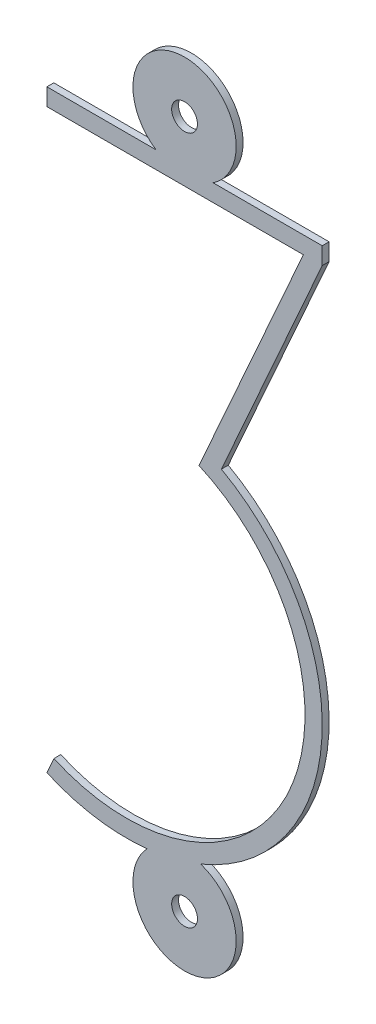
ISO-10303-21;
HEADER;
FILE_DESCRIPTION(('STEP AP214'),'2;1');
FILE_NAME('part.step','',(''),(''),'','','');
FILE_SCHEMA(('AUTOMOTIVE_DESIGN { 1 0 10303 214 1 1 1 1 }'));
ENDSEC;
DATA;
#1=APPLICATION_CONTEXT('core data for automotive mechanical design processes');
#2=APPLICATION_PROTOCOL_DEFINITION('international standard','automotive_design',2000,#1);
#3=PRODUCT_CONTEXT('',#1,'mechanical');
#4=PRODUCT('Part','Part','',(#3));
#5=PRODUCT_RELATED_PRODUCT_CATEGORY('part','',(#4));
#6=PRODUCT_DEFINITION_FORMATION('','',#4);
#7=PRODUCT_DEFINITION_CONTEXT('part definition',#1,'design');
#8=PRODUCT_DEFINITION('design','',#6,#7);
#9=PRODUCT_DEFINITION_SHAPE('','',#8);
#10=(LENGTH_UNIT() NAMED_UNIT(*) SI_UNIT(.MILLI.,.METRE.));
#11=(NAMED_UNIT(*) PLANE_ANGLE_UNIT() SI_UNIT($,.RADIAN.));
#12=(NAMED_UNIT(*) SI_UNIT($,.STERADIAN.) SOLID_ANGLE_UNIT());
#13=UNCERTAINTY_MEASURE_WITH_UNIT(LENGTH_MEASURE(1.E-05),#10,'distance_accuracy_value','');
#14=(GEOMETRIC_REPRESENTATION_CONTEXT(3) GLOBAL_UNCERTAINTY_ASSIGNED_CONTEXT((#13)) GLOBAL_UNIT_ASSIGNED_CONTEXT((#10,
#11,#12)) REPRESENTATION_CONTEXT('',''));
#15=CARTESIAN_POINT('',(0.,0.,0.));
#16=DIRECTION('',(0.,0.,1.));
#17=DIRECTION('',(1.,0.,0.));
#18=AXIS2_PLACEMENT_3D('',#15,#16,#17);
#19=CARTESIAN_POINT('',(-1.68855809367005,-3.31144190632995,0.1));
#20=DIRECTION('',(0.,0.,1.));
#21=DIRECTION('',(1.,0.,0.));
#22=AXIS2_PLACEMENT_3D('',#19,#20,#21);
#23=PLANE('',#22);
#24=CARTESIAN_POINT('',(0.,10.,0.1));
#25=DIRECTION('',(0.,0.,1.));
#26=DIRECTION('',(1.,0.,0.));
#27=AXIS2_PLACEMENT_3D('',#24,#25,#26);
#28=CIRCLE('',#27,0.375);
#29=CARTESIAN_POINT('',(0.375000000000002,10.,0.1));
#30=VERTEX_POINT('',#29);
#31=EDGE_CURVE('E166',#30,#30,#28,.T.);
#32=ORIENTED_EDGE('',*,*,#31,.F.);
#33=EDGE_LOOP('',(#32));
#34=FACE_BOUND('',#33,.T.);
#35=DIRECTION('',(0.,-1.,0.));
#36=VECTOR('',#35,1.);
#37=CARTESIAN_POINT('',(-4.,8.75,0.1));
#38=LINE('',#37,#36);
#39=CARTESIAN_POINT('',(-4.,8.75,0.1));
#40=VERTEX_POINT('',#39);
#41=CARTESIAN_POINT('',(-4.,8.25,0.1));
#42=VERTEX_POINT('',#41);
#43=EDGE_CURVE('E187',#40,#42,#38,.T.);
#44=ORIENTED_EDGE('',*,*,#43,.T.);
#45=DIRECTION('',(1.,0.,0.));
#46=VECTOR('',#45,1.);
#47=CARTESIAN_POINT('',(-4.,8.25,0.1));
#48=LINE('',#47,#46);
#49=CARTESIAN_POINT('',(3.45278977079677,8.25,0.1));
#50=VERTEX_POINT('',#49);
#51=EDGE_CURVE('E110',#42,#50,#48,.T.);
#52=ORIENTED_EDGE('',*,*,#51,.T.);
#53=DIRECTION('',(-0.406331774813376,-0.913725609128371,0.));
#54=VECTOR('',#53,1.);
#55=CARTESIAN_POINT('',(3.45278977079677,8.25,0.1));
#56=LINE('',#55,#54);
#57=CARTESIAN_POINT('',(0.419717925253206,1.42947649830665,0.1));
#58=VERTEX_POINT('',#57);
#59=EDGE_CURVE('E217',#50,#58,#56,.T.);
#60=ORIENTED_EDGE('',*,*,#59,.T.);
#61=CARTESIAN_POINT('',(-1.68855809367005,-3.31144190632995,0.1));
#62=DIRECTION('',(0.,0.,-1.));
#63=DIRECTION('',(1.,0.,0.));
#64=AXIS2_PLACEMENT_3D('',#61,#62,#63);
#65=CIRCLE('',#64,5.18855809367005);
#66=CARTESIAN_POINT('',(-3.79683411259331,-8.05236031096655,0.1));
#67=VERTEX_POINT('',#66);
#68=EDGE_CURVE('E236',#58,#67,#65,.T.);
#69=ORIENTED_EDGE('',*,*,#68,.T.);
#70=DIRECTION('',(-0.406331774813376,-0.913725609128371,0.));
#71=VECTOR('',#70,1.);
#72=CARTESIAN_POINT('',(-4.,-8.50922311553074,0.1));
#73=LINE('',#72,#71);
#74=CARTESIAN_POINT('',(-4.,-8.50922311553074,0.1));
#75=VERTEX_POINT('',#74);
#76=EDGE_CURVE('E233',#67,#75,#73,.T.);
#77=ORIENTED_EDGE('',*,*,#76,.T.);
#78=CARTESIAN_POINT('',(-1.68855809367005,-3.31144190632995,0.1));
#79=DIRECTION('',(0.,0.,1.));
#80=DIRECTION('',(1.,0.,0.));
#81=AXIS2_PLACEMENT_3D('',#78,#79,#80);
#82=CIRCLE('',#81,5.68855809367005);
#83=CARTESIAN_POINT('',(-1.08885039227427,-8.96830003235235,0.1));
#84=VERTEX_POINT('',#83);
#85=EDGE_CURVE('E235',#75,#84,#82,.T.);
#86=ORIENTED_EDGE('',*,*,#85,.T.);
#87=CARTESIAN_POINT('',(0.,-10.,0.1));
#88=DIRECTION('',(0.,0.,1.));
#89=DIRECTION('',(1.,0.,0.));
#90=AXIS2_PLACEMENT_3D('',#87,#88,#89);
#91=CIRCLE('',#90,1.5);
#92=CARTESIAN_POINT('',(0.468669320799945,-8.5750968216258,0.1));
#93=VERTEX_POINT('',#92);
#94=EDGE_CURVE('E238',#84,#93,#91,.T.);
#95=ORIENTED_EDGE('',*,*,#94,.T.);
#96=CARTESIAN_POINT('',(-1.68855809367005,-3.31144190632995,0.1));
#97=DIRECTION('',(0.,0.,1.));
#98=DIRECTION('',(1.,0.,0.));
#99=AXIS2_PLACEMENT_3D('',#96,#97,#98);
#100=CIRCLE('',#99,5.68855809367005);
#101=CARTESIAN_POINT('',(1.07080059765104,1.66305633949241,0.1));
#102=VERTEX_POINT('',#101);
#103=EDGE_CURVE('E244',#93,#102,#100,.T.);
#104=ORIENTED_EDGE('',*,*,#103,.T.);
#105=DIRECTION('',(0.406331774813376,0.913725609128371,0.));
#106=VECTOR('',#105,1.);
#107=CARTESIAN_POINT('',(4.,8.25,0.1));
#108=LINE('',#107,#106);
#109=CARTESIAN_POINT('',(4.,8.25,0.1));
#110=VERTEX_POINT('',#109);
#111=EDGE_CURVE('E246',#102,#110,#108,.T.);
#112=ORIENTED_EDGE('',*,*,#111,.T.);
#113=DIRECTION('',(0.,1.,0.));
#114=VECTOR('',#113,1.);
#115=CARTESIAN_POINT('',(4.,8.75,0.1));
#116=LINE('',#115,#114);
#117=CARTESIAN_POINT('',(4.,8.75,0.1));
#118=VERTEX_POINT('',#117);
#119=EDGE_CURVE('E144',#110,#118,#116,.T.);
#120=ORIENTED_EDGE('',*,*,#119,.T.);
#121=DIRECTION('',(-1.,0.,0.));
#122=VECTOR('',#121,1.);
#123=CARTESIAN_POINT('',(0.829156197588854,8.75,0.1));
#124=LINE('',#123,#122);
#125=CARTESIAN_POINT('',(0.829156197588853,8.75,0.1));
#126=VERTEX_POINT('',#125);
#127=EDGE_CURVE('E138',#118,#126,#124,.T.);
#128=ORIENTED_EDGE('',*,*,#127,.T.);
#129=CARTESIAN_POINT('',(0.,10.,0.1));
#130=DIRECTION('',(0.,0.,1.));
#131=DIRECTION('',(1.,0.,0.));
#132=AXIS2_PLACEMENT_3D('',#129,#130,#131);
#133=CIRCLE('',#132,1.5);
#134=CARTESIAN_POINT('',(-0.829156197588848,8.75,0.1));
#135=VERTEX_POINT('',#134);
#136=EDGE_CURVE('E142',#126,#135,#133,.T.);
#137=ORIENTED_EDGE('',*,*,#136,.T.);
#138=DIRECTION('',(-1.,0.,0.));
#139=VECTOR('',#138,1.);
#140=CARTESIAN_POINT('',(-4.,8.75,0.1));
#141=LINE('',#140,#139);
#142=EDGE_CURVE('E52',#135,#40,#141,.T.);
#143=ORIENTED_EDGE('',*,*,#142,.T.);
#144=EDGE_LOOP('',(#44,#52,#60,#69,#77,#86,#95,#104,#112,#120,#128,#137,#143));
#145=FACE_BOUND('',#144,.T.);
#146=CARTESIAN_POINT('',(0.,-10.,0.1));
#147=DIRECTION('',(0.,0.,1.));
#148=DIRECTION('',(1.,0.,0.));
#149=AXIS2_PLACEMENT_3D('',#146,#147,#148);
#150=CIRCLE('',#149,0.375);
#151=CARTESIAN_POINT('',(0.375,-10.,0.1));
#152=VERTEX_POINT('',#151);
#153=EDGE_CURVE('E288',#152,#152,#150,.T.);
#154=ORIENTED_EDGE('',*,*,#153,.F.);
#155=EDGE_LOOP('',(#154));
#156=FACE_BOUND('',#155,.T.);
#157=ADVANCED_FACE('F35',(#34,#145,#156),#23,.T.);
#158=CARTESIAN_POINT('',(-1.68855809367005,-3.31144190632995,-0.1));
#159=DIRECTION('',(0.,0.,1.));
#160=DIRECTION('',(1.,0.,0.));
#161=AXIS2_PLACEMENT_3D('',#158,#159,#160);
#162=PLANE('',#161);
#163=DIRECTION('',(0.,-1.,0.));
#164=VECTOR('',#163,1.);
#165=CARTESIAN_POINT('',(-4.,8.75,-0.1));
#166=LINE('',#165,#164);
#167=CARTESIAN_POINT('',(-4.,8.75,-0.1));
#168=VERTEX_POINT('',#167);
#169=CARTESIAN_POINT('',(-4.,8.25,-0.1));
#170=VERTEX_POINT('',#169);
#171=EDGE_CURVE('E162',#168,#170,#166,.T.);
#172=ORIENTED_EDGE('',*,*,#171,.F.);
#173=DIRECTION('',(-1.,0.,0.));
#174=VECTOR('',#173,1.);
#175=CARTESIAN_POINT('',(-4.,8.75,-0.1));
#176=LINE('',#175,#174);
#177=CARTESIAN_POINT('',(-0.829156197588848,8.75,-0.1));
#178=VERTEX_POINT('',#177);
#179=EDGE_CURVE('E102',#178,#168,#176,.T.);
#180=ORIENTED_EDGE('',*,*,#179,.F.);
#181=CARTESIAN_POINT('',(0.,10.,-0.1));
#182=DIRECTION('',(0.,0.,1.));
#183=DIRECTION('',(1.,0.,0.));
#184=AXIS2_PLACEMENT_3D('',#181,#182,#183);
#185=CIRCLE('',#184,1.5);
#186=CARTESIAN_POINT('',(0.829156197588853,8.75,-0.1));
#187=VERTEX_POINT('',#186);
#188=EDGE_CURVE('E96',#187,#178,#185,.T.);
#189=ORIENTED_EDGE('',*,*,#188,.F.);
#190=DIRECTION('',(-1.,0.,0.));
#191=VECTOR('',#190,1.);
#192=CARTESIAN_POINT('',(0.829156197588854,8.75,-0.1));
#193=LINE('',#192,#191);
#194=CARTESIAN_POINT('',(4.,8.75,-0.1));
#195=VERTEX_POINT('',#194);
#196=EDGE_CURVE('E152',#195,#187,#193,.T.);
#197=ORIENTED_EDGE('',*,*,#196,.F.);
#198=DIRECTION('',(0.,1.,0.));
#199=VECTOR('',#198,1.);
#200=CARTESIAN_POINT('',(4.,8.75,-0.1));
#201=LINE('',#200,#199);
#202=CARTESIAN_POINT('',(4.,8.25,-0.1));
#203=VERTEX_POINT('',#202);
#204=EDGE_CURVE('E182',#203,#195,#201,.T.);
#205=ORIENTED_EDGE('',*,*,#204,.F.);
#206=DIRECTION('',(0.406331774813376,0.913725609128371,0.));
#207=VECTOR('',#206,1.);
#208=CARTESIAN_POINT('',(4.,8.25,-0.1));
#209=LINE('',#208,#207);
#210=CARTESIAN_POINT('',(1.07080059765104,1.66305633949241,-0.1));
#211=VERTEX_POINT('',#210);
#212=EDGE_CURVE('E180',#211,#203,#209,.T.);
#213=ORIENTED_EDGE('',*,*,#212,.F.);
#214=CARTESIAN_POINT('',(-1.68855809367005,-3.31144190632995,-0.1));
#215=DIRECTION('',(0.,0.,1.));
#216=DIRECTION('',(1.,0.,0.));
#217=AXIS2_PLACEMENT_3D('',#214,#215,#216);
#218=CIRCLE('',#217,5.68855809367005);
#219=CARTESIAN_POINT('',(0.468669320799945,-8.5750968216258,-0.1));
#220=VERTEX_POINT('',#219);
#221=EDGE_CURVE('E178',#220,#211,#218,.T.);
#222=ORIENTED_EDGE('',*,*,#221,.F.);
#223=CARTESIAN_POINT('',(0.,-10.,-0.1));
#224=DIRECTION('',(0.,0.,1.));
#225=DIRECTION('',(1.,0.,0.));
#226=AXIS2_PLACEMENT_3D('',#223,#224,#225);
#227=CIRCLE('',#226,1.5);
#228=CARTESIAN_POINT('',(-1.08885039227427,-8.96830003235235,-0.1));
#229=VERTEX_POINT('',#228);
#230=EDGE_CURVE('E176',#229,#220,#227,.T.);
#231=ORIENTED_EDGE('',*,*,#230,.F.);
#232=CARTESIAN_POINT('',(-1.68855809367005,-3.31144190632995,-0.1));
#233=DIRECTION('',(0.,0.,1.));
#234=DIRECTION('',(1.,0.,0.));
#235=AXIS2_PLACEMENT_3D('',#232,#233,#234);
#236=CIRCLE('',#235,5.68855809367005);
#237=CARTESIAN_POINT('',(-4.,-8.50922311553074,-0.1));
#238=VERTEX_POINT('',#237);
#239=EDGE_CURVE('E174',#238,#229,#236,.T.);
#240=ORIENTED_EDGE('',*,*,#239,.F.);
#241=DIRECTION('',(-0.406331774813376,-0.913725609128371,0.));
#242=VECTOR('',#241,1.);
#243=CARTESIAN_POINT('',(-4.,-8.50922311553074,-0.1));
#244=LINE('',#243,#242);
#245=CARTESIAN_POINT('',(-3.79683411259331,-8.05236031096655,-0.1));
#246=VERTEX_POINT('',#245);
#247=EDGE_CURVE('E172',#246,#238,#244,.T.);
#248=ORIENTED_EDGE('',*,*,#247,.F.);
#249=CARTESIAN_POINT('',(-1.68855809367005,-3.31144190632995,-0.1));
#250=DIRECTION('',(0.,0.,-1.));
#251=DIRECTION('',(1.,0.,0.));
#252=AXIS2_PLACEMENT_3D('',#249,#250,#251);
#253=CIRCLE('',#252,5.18855809367005);
#254=CARTESIAN_POINT('',(0.419717925253206,1.42947649830665,-0.1));
#255=VERTEX_POINT('',#254);
#256=EDGE_CURVE('E170',#255,#246,#253,.T.);
#257=ORIENTED_EDGE('',*,*,#256,.F.);
#258=DIRECTION('',(-0.406331774813376,-0.913725609128371,0.));
#259=VECTOR('',#258,1.);
#260=CARTESIAN_POINT('',(3.45278977079677,8.25,-0.1));
#261=LINE('',#260,#259);
#262=CARTESIAN_POINT('',(3.45278977079677,8.25,-0.1));
#263=VERTEX_POINT('',#262);
#264=EDGE_CURVE('E168',#263,#255,#261,.T.);
#265=ORIENTED_EDGE('',*,*,#264,.F.);
#266=DIRECTION('',(1.,0.,0.));
#267=VECTOR('',#266,1.);
#268=CARTESIAN_POINT('',(-4.,8.25,-0.1));
#269=LINE('',#268,#267);
#270=EDGE_CURVE('E165',#170,#263,#269,.T.);
#271=ORIENTED_EDGE('',*,*,#270,.F.);
#272=EDGE_LOOP('',(#172,#180,#189,#197,#205,#213,#222,#231,#240,#248,#257,#265,#271));
#273=FACE_BOUND('',#272,.T.);
#274=CARTESIAN_POINT('',(0.,10.,-0.1));
#275=DIRECTION('',(0.,0.,1.));
#276=DIRECTION('',(1.,0.,0.));
#277=AXIS2_PLACEMENT_3D('',#274,#275,#276);
#278=CIRCLE('',#277,0.375);
#279=CARTESIAN_POINT('',(0.375000000000002,10.,-0.1));
#280=VERTEX_POINT('',#279);
#281=EDGE_CURVE('E294',#280,#280,#278,.T.);
#282=ORIENTED_EDGE('',*,*,#281,.T.);
#283=EDGE_LOOP('',(#282));
#284=FACE_BOUND('',#283,.T.);
#285=CARTESIAN_POINT('',(0.,-10.,-0.1));
#286=DIRECTION('',(0.,0.,1.));
#287=DIRECTION('',(1.,0.,0.));
#288=AXIS2_PLACEMENT_3D('',#285,#286,#287);
#289=CIRCLE('',#288,0.375);
#290=CARTESIAN_POINT('',(0.375,-10.,-0.1));
#291=VERTEX_POINT('',#290);
#292=EDGE_CURVE('E291',#291,#291,#289,.T.);
#293=ORIENTED_EDGE('',*,*,#292,.T.);
#294=EDGE_LOOP('',(#293));
#295=FACE_BOUND('',#294,.T.);
#296=ADVANCED_FACE('F221',(#273,#284,#295),#162,.F.);
#297=CARTESIAN_POINT('',(-4.,8.75,0.1));
#298=DIRECTION('',(1.,0.,0.));
#299=DIRECTION('',(0.,0.,-1.));
#300=AXIS2_PLACEMENT_3D('',#297,#298,#299);
#301=PLANE('',#300);
#302=ORIENTED_EDGE('',*,*,#171,.T.);
#303=DIRECTION('',(0.,0.,-1.));
#304=VECTOR('',#303,1.);
#305=CARTESIAN_POINT('',(-4.,8.25,0.1));
#306=LINE('',#305,#304);
#307=EDGE_CURVE('E11',#42,#170,#306,.T.);
#308=ORIENTED_EDGE('',*,*,#307,.F.);
#309=ORIENTED_EDGE('',*,*,#43,.F.);
#310=DIRECTION('',(0.,0.,-1.));
#311=VECTOR('',#310,1.);
#312=CARTESIAN_POINT('',(-4.,8.75,0.1));
#313=LINE('',#312,#311);
#314=EDGE_CURVE('E158',#40,#168,#313,.T.);
#315=ORIENTED_EDGE('',*,*,#314,.T.);
#316=EDGE_LOOP('',(#302,#308,#309,#315));
#317=FACE_BOUND('',#316,.T.);
#318=ADVANCED_FACE('F37',(#317),#301,.F.);
#319=CARTESIAN_POINT('',(-4.,8.25,0.1));
#320=DIRECTION('',(0.,1.,0.));
#321=DIRECTION('',(-1.,0.,0.));
#322=AXIS2_PLACEMENT_3D('',#319,#320,#321);
#323=PLANE('',#322);
#324=ORIENTED_EDGE('',*,*,#270,.T.);
#325=DIRECTION('',(0.,0.,-1.));
#326=VECTOR('',#325,1.);
#327=CARTESIAN_POINT('',(3.45278977079677,8.25,0.1));
#328=LINE('',#327,#326);
#329=EDGE_CURVE('E44',#50,#263,#328,.T.);
#330=ORIENTED_EDGE('',*,*,#329,.F.);
#331=ORIENTED_EDGE('',*,*,#51,.F.);
#332=ORIENTED_EDGE('',*,*,#307,.T.);
#333=EDGE_LOOP('',(#324,#330,#331,#332));
#334=FACE_BOUND('',#333,.T.);
#335=ADVANCED_FACE('F397',(#334),#323,.F.);
#336=CARTESIAN_POINT('',(3.45278977079677,8.25,0.1));
#337=DIRECTION('',(0.913725609128371,-0.406331774813376,0.));
#338=DIRECTION('',(0.406331774813376,0.913725609128371,0.));
#339=AXIS2_PLACEMENT_3D('',#336,#337,#338);
#340=PLANE('',#339);
#341=ORIENTED_EDGE('',*,*,#264,.T.);
#342=DIRECTION('',(0.,0.,-1.));
#343=VECTOR('',#342,1.);
#344=CARTESIAN_POINT('',(0.419717925253206,1.42947649830665,0.1));
#345=LINE('',#344,#343);
#346=EDGE_CURVE('E209',#58,#255,#345,.T.);
#347=ORIENTED_EDGE('',*,*,#346,.F.);
#348=ORIENTED_EDGE('',*,*,#59,.F.);
#349=ORIENTED_EDGE('',*,*,#329,.T.);
#350=EDGE_LOOP('',(#341,#347,#348,#349));
#351=FACE_BOUND('',#350,.T.);
#352=ADVANCED_FACE('F215',(#351),#340,.F.);
#353=CARTESIAN_POINT('',(-1.68855809367005,-3.31144190632995,0.1));
#354=DIRECTION('',(0.,0.,-1.));
#355=DIRECTION('',(-1.,0.,0.));
#356=AXIS2_PLACEMENT_3D('',#353,#354,#355);
#357=CYLINDRICAL_SURFACE('',#356,5.18855809367005);
#358=ORIENTED_EDGE('',*,*,#256,.T.);
#359=DIRECTION('',(0.,0.,-1.));
#360=VECTOR('',#359,1.);
#361=CARTESIAN_POINT('',(-3.79683411259331,-8.05236031096655,0.1));
#362=LINE('',#361,#360);
#363=EDGE_CURVE('E206',#67,#246,#362,.T.);
#364=ORIENTED_EDGE('',*,*,#363,.F.);
#365=ORIENTED_EDGE('',*,*,#68,.F.);
#366=ORIENTED_EDGE('',*,*,#346,.T.);
#367=EDGE_LOOP('',(#358,#364,#365,#366));
#368=FACE_BOUND('',#367,.T.);
#369=ADVANCED_FACE('F227',(#368),#357,.F.);
#370=CARTESIAN_POINT('',(-4.,-8.50922311553074,0.1));
#371=DIRECTION('',(0.913725609128371,-0.406331774813376,0.));
#372=DIRECTION('',(0.406331774813376,0.913725609128371,0.));
#373=AXIS2_PLACEMENT_3D('',#370,#371,#372);
#374=PLANE('',#373);
#375=ORIENTED_EDGE('',*,*,#247,.T.);
#376=DIRECTION('',(0.,0.,-1.));
#377=VECTOR('',#376,1.);
#378=CARTESIAN_POINT('',(-4.,-8.50922311553074,0.1));
#379=LINE('',#378,#377);
#380=EDGE_CURVE('E203',#75,#238,#379,.T.);
#381=ORIENTED_EDGE('',*,*,#380,.F.);
#382=ORIENTED_EDGE('',*,*,#76,.F.);
#383=ORIENTED_EDGE('',*,*,#363,.T.);
#384=EDGE_LOOP('',(#375,#381,#382,#383));
#385=FACE_BOUND('',#384,.T.);
#386=ADVANCED_FACE('F231',(#385),#374,.F.);
#387=CARTESIAN_POINT('',(-1.68855809367005,-3.31144190632995,0.1));
#388=DIRECTION('',(0.,0.,-1.));
#389=DIRECTION('',(-1.,0.,0.));
#390=AXIS2_PLACEMENT_3D('',#387,#388,#389);
#391=CYLINDRICAL_SURFACE('',#390,5.68855809367005);
#392=ORIENTED_EDGE('',*,*,#239,.T.);
#393=DIRECTION('',(0.,0.,-1.));
#394=VECTOR('',#393,1.);
#395=CARTESIAN_POINT('',(-1.08885039227427,-8.96830003235235,0.1));
#396=LINE('',#395,#394);
#397=EDGE_CURVE('E200',#84,#229,#396,.T.);
#398=ORIENTED_EDGE('',*,*,#397,.F.);
#399=ORIENTED_EDGE('',*,*,#85,.F.);
#400=ORIENTED_EDGE('',*,*,#380,.T.);
#401=EDGE_LOOP('',(#392,#398,#399,#400));
#402=FACE_BOUND('',#401,.T.);
#403=ADVANCED_FACE('F362',(#402),#391,.T.);
#404=CARTESIAN_POINT('',(0.,-10.,0.1));
#405=DIRECTION('',(0.,0.,-1.));
#406=DIRECTION('',(-1.,0.,0.));
#407=AXIS2_PLACEMENT_3D('',#404,#405,#406);
#408=CYLINDRICAL_SURFACE('',#407,1.5);
#409=ORIENTED_EDGE('',*,*,#230,.T.);
#410=DIRECTION('',(0.,0.,-1.));
#411=VECTOR('',#410,1.);
#412=CARTESIAN_POINT('',(0.468669320799945,-8.5750968216258,0.1));
#413=LINE('',#412,#411);
#414=EDGE_CURVE('E197',#93,#220,#413,.T.);
#415=ORIENTED_EDGE('',*,*,#414,.F.);
#416=ORIENTED_EDGE('',*,*,#94,.F.);
#417=ORIENTED_EDGE('',*,*,#397,.T.);
#418=EDGE_LOOP('',(#409,#415,#416,#417));
#419=FACE_BOUND('',#418,.T.);
#420=ADVANCED_FACE('F352',(#419),#408,.T.);
#421=CARTESIAN_POINT('',(-1.68855809367005,-3.31144190632995,0.1));
#422=DIRECTION('',(0.,0.,-1.));
#423=DIRECTION('',(-1.,0.,0.));
#424=AXIS2_PLACEMENT_3D('',#421,#422,#423);
#425=CYLINDRICAL_SURFACE('',#424,5.68855809367005);
#426=ORIENTED_EDGE('',*,*,#221,.T.);
#427=DIRECTION('',(0.,0.,-1.));
#428=VECTOR('',#427,1.);
#429=CARTESIAN_POINT('',(1.07080059765104,1.66305633949241,0.1));
#430=LINE('',#429,#428);
#431=EDGE_CURVE('E194',#102,#211,#430,.T.);
#432=ORIENTED_EDGE('',*,*,#431,.F.);
#433=ORIENTED_EDGE('',*,*,#103,.F.);
#434=ORIENTED_EDGE('',*,*,#414,.T.);
#435=EDGE_LOOP('',(#426,#432,#433,#434));
#436=FACE_BOUND('',#435,.T.);
#437=ADVANCED_FACE('F343',(#436),#425,.T.);
#438=CARTESIAN_POINT('',(4.,8.25,0.1));
#439=DIRECTION('',(-0.913725609128371,0.406331774813376,0.));
#440=DIRECTION('',(-0.406331774813376,-0.913725609128371,0.));
#441=AXIS2_PLACEMENT_3D('',#438,#439,#440);
#442=PLANE('',#441);
#443=ORIENTED_EDGE('',*,*,#212,.T.);
#444=DIRECTION('',(0.,0.,-1.));
#445=VECTOR('',#444,1.);
#446=CARTESIAN_POINT('',(4.,8.25,0.1));
#447=LINE('',#446,#445);
#448=EDGE_CURVE('E191',#110,#203,#447,.T.);
#449=ORIENTED_EDGE('',*,*,#448,.F.);
#450=ORIENTED_EDGE('',*,*,#111,.F.);
#451=ORIENTED_EDGE('',*,*,#431,.T.);
#452=EDGE_LOOP('',(#443,#449,#450,#451));
#453=FACE_BOUND('',#452,.T.);
#454=ADVANCED_FACE('F252',(#453),#442,.F.);
#455=CARTESIAN_POINT('',(4.,8.75,0.1));
#456=DIRECTION('',(-1.,0.,0.));
#457=DIRECTION('',(0.,0.,1.));
#458=AXIS2_PLACEMENT_3D('',#455,#456,#457);
#459=PLANE('',#458);
#460=ORIENTED_EDGE('',*,*,#204,.T.);
#461=DIRECTION('',(0.,0.,-1.));
#462=VECTOR('',#461,1.);
#463=CARTESIAN_POINT('',(4.,8.75,0.1));
#464=LINE('',#463,#462);
#465=EDGE_CURVE('E153',#118,#195,#464,.T.);
#466=ORIENTED_EDGE('',*,*,#465,.F.);
#467=ORIENTED_EDGE('',*,*,#119,.F.);
#468=ORIENTED_EDGE('',*,*,#448,.T.);
#469=EDGE_LOOP('',(#460,#466,#467,#468));
#470=FACE_BOUND('',#469,.T.);
#471=ADVANCED_FACE('F256',(#470),#459,.F.);
#472=CARTESIAN_POINT('',(0.829156197588854,8.75,0.1));
#473=DIRECTION('',(0.,-1.,0.));
#474=DIRECTION('',(0.,0.,-1.));
#475=AXIS2_PLACEMENT_3D('',#472,#473,#474);
#476=PLANE('',#475);
#477=ORIENTED_EDGE('',*,*,#196,.T.);
#478=DIRECTION('',(0.,0.,-1.));
#479=VECTOR('',#478,1.);
#480=CARTESIAN_POINT('',(0.829156197588853,8.75,0.1));
#481=LINE('',#480,#479);
#482=EDGE_CURVE('E149',#126,#187,#481,.T.);
#483=ORIENTED_EDGE('',*,*,#482,.F.);
#484=ORIENTED_EDGE('',*,*,#127,.F.);
#485=ORIENTED_EDGE('',*,*,#465,.T.);
#486=EDGE_LOOP('',(#477,#483,#484,#485));
#487=FACE_BOUND('',#486,.T.);
#488=ADVANCED_FACE('F150',(#487),#476,.F.);
#489=CARTESIAN_POINT('',(0.,10.,0.1));
#490=DIRECTION('',(0.,0.,-1.));
#491=DIRECTION('',(-1.,0.,0.));
#492=AXIS2_PLACEMENT_3D('',#489,#490,#491);
#493=CYLINDRICAL_SURFACE('',#492,1.5);
#494=ORIENTED_EDGE('',*,*,#188,.T.);
#495=DIRECTION('',(0.,0.,-1.));
#496=VECTOR('',#495,1.);
#497=CARTESIAN_POINT('',(-0.829156197588848,8.75,0.1));
#498=LINE('',#497,#496);
#499=EDGE_CURVE('E154',#135,#178,#498,.T.);
#500=ORIENTED_EDGE('',*,*,#499,.F.);
#501=ORIENTED_EDGE('',*,*,#136,.F.);
#502=ORIENTED_EDGE('',*,*,#482,.T.);
#503=EDGE_LOOP('',(#494,#500,#501,#502));
#504=FACE_BOUND('',#503,.T.);
#505=ADVANCED_FACE('F156',(#504),#493,.T.);
#506=CARTESIAN_POINT('',(-4.,8.75,0.1));
#507=DIRECTION('',(0.,-1.,0.));
#508=DIRECTION('',(1.,0.,0.));
#509=AXIS2_PLACEMENT_3D('',#506,#507,#508);
#510=PLANE('',#509);
#511=ORIENTED_EDGE('',*,*,#179,.T.);
#512=ORIENTED_EDGE('',*,*,#314,.F.);
#513=ORIENTED_EDGE('',*,*,#142,.F.);
#514=ORIENTED_EDGE('',*,*,#499,.T.);
#515=EDGE_LOOP('',(#511,#512,#513,#514));
#516=FACE_BOUND('',#515,.T.);
#517=ADVANCED_FACE('F260',(#516),#510,.F.);
#518=CARTESIAN_POINT('',(0.,10.,0.1));
#519=DIRECTION('',(0.,0.,-1.));
#520=DIRECTION('',(-1.,0.,0.));
#521=AXIS2_PLACEMENT_3D('',#518,#519,#520);
#522=CYLINDRICAL_SURFACE('',#521,0.375);
#523=ORIENTED_EDGE('',*,*,#31,.T.);
#524=EDGE_LOOP('',(#523));
#525=FACE_BOUND('',#524,.T.);
#526=ORIENTED_EDGE('',*,*,#281,.F.);
#527=EDGE_LOOP('',(#526));
#528=FACE_BOUND('',#527,.T.);
#529=ADVANCED_FACE('F262',(#525,#528),#522,.F.);
#530=CARTESIAN_POINT('',(0.,-10.,0.1));
#531=DIRECTION('',(0.,0.,-1.));
#532=DIRECTION('',(-1.,0.,0.));
#533=AXIS2_PLACEMENT_3D('',#530,#531,#532);
#534=CYLINDRICAL_SURFACE('',#533,0.375);
#535=ORIENTED_EDGE('',*,*,#153,.T.);
#536=EDGE_LOOP('',(#535));
#537=FACE_BOUND('',#536,.T.);
#538=ORIENTED_EDGE('',*,*,#292,.F.);
#539=EDGE_LOOP('',(#538));
#540=FACE_BOUND('',#539,.T.);
#541=ADVANCED_FACE('F268',(#537,#540),#534,.F.);
#542=CLOSED_SHELL('',(#157,#296,#318,#335,#352,#369,#386,#403,#420,#437,#454,#471,#488,#505,
#517,#529,#541));
#543=MANIFOLD_SOLID_BREP('B2',#542);
#544=ADVANCED_BREP_SHAPE_REPRESENTATION('',(#18,#543),#14);
#545=SHAPE_DEFINITION_REPRESENTATION(#9,#544);
ENDSEC;
END-ISO-10303-21;
